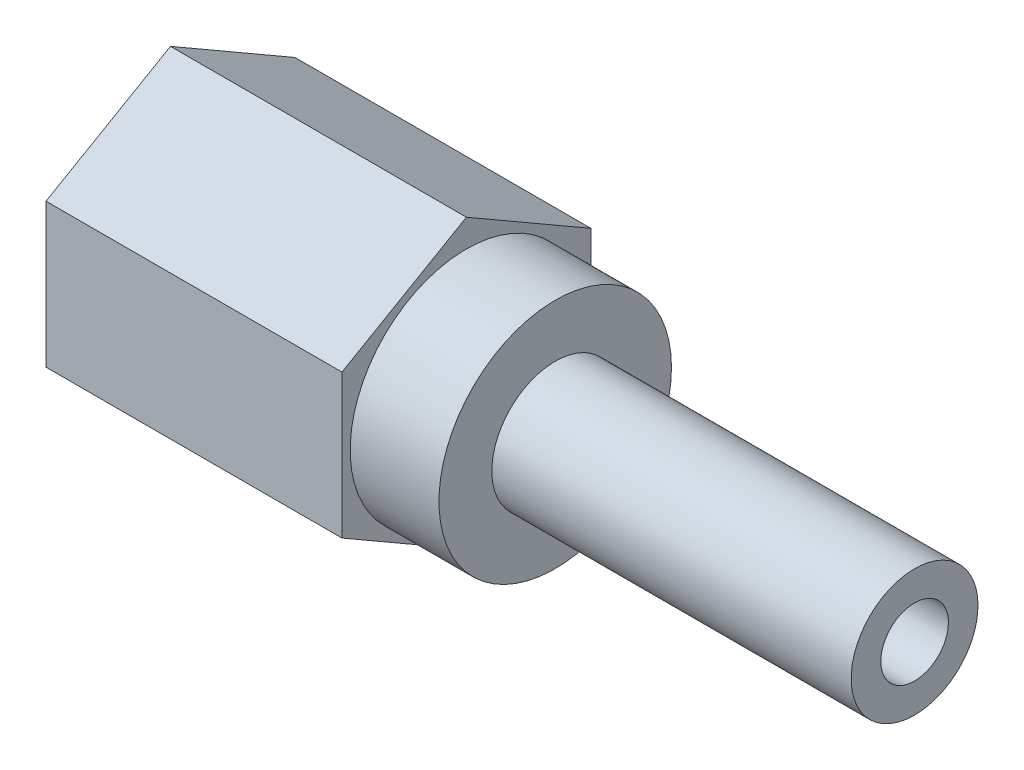
ISO-10303-21;
HEADER;
FILE_DESCRIPTION(('STEP AP214'),'2;1');
FILE_NAME('part.step','',(''),(''),'','','');
FILE_SCHEMA(('AUTOMOTIVE_DESIGN { 1 0 10303 214 1 1 1 1 }'));
ENDSEC;
DATA;
#1=APPLICATION_CONTEXT('core data for automotive mechanical design processes');
#2=APPLICATION_PROTOCOL_DEFINITION('international standard','automotive_design',2000,#1);
#3=PRODUCT_CONTEXT('',#1,'mechanical');
#4=PRODUCT('Part','Part','',(#3));
#5=PRODUCT_RELATED_PRODUCT_CATEGORY('part','',(#4));
#6=PRODUCT_DEFINITION_FORMATION('','',#4);
#7=PRODUCT_DEFINITION_CONTEXT('part definition',#1,'design');
#8=PRODUCT_DEFINITION('design','',#6,#7);
#9=PRODUCT_DEFINITION_SHAPE('','',#8);
#10=(LENGTH_UNIT() NAMED_UNIT(*) SI_UNIT(.MILLI.,.METRE.));
#11=(NAMED_UNIT(*) PLANE_ANGLE_UNIT() SI_UNIT($,.RADIAN.));
#12=(NAMED_UNIT(*) SI_UNIT($,.STERADIAN.) SOLID_ANGLE_UNIT());
#13=UNCERTAINTY_MEASURE_WITH_UNIT(LENGTH_MEASURE(1.E-05),#10,'distance_accuracy_value','');
#14=(GEOMETRIC_REPRESENTATION_CONTEXT(3) GLOBAL_UNCERTAINTY_ASSIGNED_CONTEXT((#13)) GLOBAL_UNIT_ASSIGNED_CONTEXT((#10,
#11,#12)) REPRESENTATION_CONTEXT('',''));
#15=CARTESIAN_POINT('',(0.,0.,0.));
#16=DIRECTION('',(0.,0.,1.));
#17=DIRECTION('',(1.,0.,0.));
#18=AXIS2_PLACEMENT_3D('',#15,#16,#17);
#19=CARTESIAN_POINT('',(7.,1.7,-2.94448637286709));
#20=DIRECTION('',(0.,-0.866025403784439,0.5));
#21=DIRECTION('',(0.,-0.5,-0.866025403784439));
#22=AXIS2_PLACEMENT_3D('',#19,#20,#21);
#23=PLANE('',#22);
#24=DIRECTION('',(0.,0.5,0.866025403784439));
#25=VECTOR('',#24,1.);
#26=CARTESIAN_POINT('',(0.,1.7,-2.94448637286709));
#27=LINE('',#26,#25);
#28=CARTESIAN_POINT('',(0.,1.7,-2.94448637286709));
#29=VERTEX_POINT('',#28);
#30=CARTESIAN_POINT('',(0.,3.4,0.));
#31=VERTEX_POINT('',#30);
#32=EDGE_CURVE('E136',#29,#31,#27,.T.);
#33=ORIENTED_EDGE('',*,*,#32,.T.);
#34=DIRECTION('',(-1.,0.,0.));
#35=VECTOR('',#34,1.);
#36=CARTESIAN_POINT('',(7.,3.4,0.));
#37=LINE('',#36,#35);
#38=CARTESIAN_POINT('',(7.,3.4,0.));
#39=VERTEX_POINT('',#38);
#40=EDGE_CURVE('E47',#39,#31,#37,.T.);
#41=ORIENTED_EDGE('',*,*,#40,.F.);
#42=DIRECTION('',(0.,0.5,0.866025403784439));
#43=VECTOR('',#42,1.);
#44=CARTESIAN_POINT('',(7.,1.7,-2.94448637286709));
#45=LINE('',#44,#43);
#46=CARTESIAN_POINT('',(7.,1.7,-2.94448637286709));
#47=VERTEX_POINT('',#46);
#48=EDGE_CURVE('E153',#47,#39,#45,.T.);
#49=ORIENTED_EDGE('',*,*,#48,.F.);
#50=DIRECTION('',(-1.,0.,0.));
#51=VECTOR('',#50,1.);
#52=CARTESIAN_POINT('',(7.,1.7,-2.94448637286709));
#53=LINE('',#52,#51);
#54=EDGE_CURVE('E132',#47,#29,#53,.T.);
#55=ORIENTED_EDGE('',*,*,#54,.T.);
#56=EDGE_LOOP('',(#33,#41,#49,#55));
#57=FACE_BOUND('',#56,.T.);
#58=ADVANCED_FACE('F44',(#57),#23,.F.);
#59=CARTESIAN_POINT('',(7.,3.4,0.));
#60=DIRECTION('',(0.,-0.866025403784439,-0.5));
#61=DIRECTION('',(0.,0.5,-0.866025403784439));
#62=AXIS2_PLACEMENT_3D('',#59,#60,#61);
#63=PLANE('',#62);
#64=DIRECTION('',(0.,-0.5,0.866025403784439));
#65=VECTOR('',#64,1.);
#66=CARTESIAN_POINT('',(0.,3.4,0.));
#67=LINE('',#66,#65);
#68=CARTESIAN_POINT('',(0.,1.7,2.94448637286709));
#69=VERTEX_POINT('',#68);
#70=EDGE_CURVE('E140',#31,#69,#67,.T.);
#71=ORIENTED_EDGE('',*,*,#70,.T.);
#72=DIRECTION('',(-1.,0.,0.));
#73=VECTOR('',#72,1.);
#74=CARTESIAN_POINT('',(7.,1.7,2.94448637286709));
#75=LINE('',#74,#73);
#76=CARTESIAN_POINT('',(7.,1.7,2.94448637286709));
#77=VERTEX_POINT('',#76);
#78=EDGE_CURVE('E159',#77,#69,#75,.T.);
#79=ORIENTED_EDGE('',*,*,#78,.F.);
#80=DIRECTION('',(0.,-0.5,0.866025403784439));
#81=VECTOR('',#80,1.);
#82=CARTESIAN_POINT('',(7.,3.4,0.));
#83=LINE('',#82,#81);
#84=EDGE_CURVE('E101',#39,#77,#83,.T.);
#85=ORIENTED_EDGE('',*,*,#84,.F.);
#86=ORIENTED_EDGE('',*,*,#40,.T.);
#87=EDGE_LOOP('',(#71,#79,#85,#86));
#88=FACE_BOUND('',#87,.T.);
#89=ADVANCED_FACE('F235',(#88),#63,.F.);
#90=CARTESIAN_POINT('',(7.,1.7,2.94448637286709));
#91=DIRECTION('',(0.,0.,-1.));
#92=DIRECTION('',(-1.,0.,0.));
#93=AXIS2_PLACEMENT_3D('',#90,#91,#92);
#94=PLANE('',#93);
#95=DIRECTION('',(0.,-1.,0.));
#96=VECTOR('',#95,1.);
#97=CARTESIAN_POINT('',(0.,1.7,2.94448637286709));
#98=LINE('',#97,#96);
#99=CARTESIAN_POINT('',(0.,-1.7,2.94448637286709));
#100=VERTEX_POINT('',#99);
#101=EDGE_CURVE('E144',#69,#100,#98,.T.);
#102=ORIENTED_EDGE('',*,*,#101,.T.);
#103=DIRECTION('',(-1.,0.,0.));
#104=VECTOR('',#103,1.);
#105=CARTESIAN_POINT('',(7.,-1.7,2.94448637286709));
#106=LINE('',#105,#104);
#107=CARTESIAN_POINT('',(7.,-1.7,2.94448637286709));
#108=VERTEX_POINT('',#107);
#109=EDGE_CURVE('E125',#108,#100,#106,.T.);
#110=ORIENTED_EDGE('',*,*,#109,.F.);
#111=DIRECTION('',(0.,-1.,0.));
#112=VECTOR('',#111,1.);
#113=CARTESIAN_POINT('',(7.,1.7,2.94448637286709));
#114=LINE('',#113,#112);
#115=EDGE_CURVE('E114',#77,#108,#114,.T.);
#116=ORIENTED_EDGE('',*,*,#115,.F.);
#117=ORIENTED_EDGE('',*,*,#78,.T.);
#118=EDGE_LOOP('',(#102,#110,#116,#117));
#119=FACE_BOUND('',#118,.T.);
#120=ADVANCED_FACE('F239',(#119),#94,.F.);
#121=CARTESIAN_POINT('',(7.,-1.7,2.94448637286709));
#122=DIRECTION('',(0.,0.866025403784439,-0.5));
#123=DIRECTION('',(0.,0.5,0.866025403784439));
#124=AXIS2_PLACEMENT_3D('',#121,#122,#123);
#125=PLANE('',#124);
#126=DIRECTION('',(0.,-0.5,-0.866025403784439));
#127=VECTOR('',#126,1.);
#128=CARTESIAN_POINT('',(0.,-1.7,2.94448637286709));
#129=LINE('',#128,#127);
#130=CARTESIAN_POINT('',(0.,-3.4,0.));
#131=VERTEX_POINT('',#130);
#132=EDGE_CURVE('E123',#100,#131,#129,.T.);
#133=ORIENTED_EDGE('',*,*,#132,.T.);
#134=DIRECTION('',(-1.,0.,0.));
#135=VECTOR('',#134,1.);
#136=CARTESIAN_POINT('',(7.,-3.4,0.));
#137=LINE('',#136,#135);
#138=CARTESIAN_POINT('',(7.,-3.4,0.));
#139=VERTEX_POINT('',#138);
#140=EDGE_CURVE('E120',#139,#131,#137,.T.);
#141=ORIENTED_EDGE('',*,*,#140,.F.);
#142=DIRECTION('',(0.,-0.5,-0.866025403784439));
#143=VECTOR('',#142,1.);
#144=CARTESIAN_POINT('',(7.,-1.7,2.94448637286709));
#145=LINE('',#144,#143);
#146=EDGE_CURVE('E108',#108,#139,#145,.T.);
#147=ORIENTED_EDGE('',*,*,#146,.F.);
#148=ORIENTED_EDGE('',*,*,#109,.T.);
#149=EDGE_LOOP('',(#133,#141,#147,#148));
#150=FACE_BOUND('',#149,.T.);
#151=ADVANCED_FACE('F121',(#150),#125,.F.);
#152=CARTESIAN_POINT('',(7.,-3.4,0.));
#153=DIRECTION('',(0.,0.866025403784438,0.5));
#154=DIRECTION('',(0.,-0.5,0.866025403784439));
#155=AXIS2_PLACEMENT_3D('',#152,#153,#154);
#156=PLANE('',#155);
#157=DIRECTION('',(0.,0.5,-0.866025403784438));
#158=VECTOR('',#157,1.);
#159=CARTESIAN_POINT('',(0.,-3.4,0.));
#160=LINE('',#159,#158);
#161=CARTESIAN_POINT('',(0.,-1.7,-2.94448637286709));
#162=VERTEX_POINT('',#161);
#163=EDGE_CURVE('E86',#131,#162,#160,.T.);
#164=ORIENTED_EDGE('',*,*,#163,.T.);
#165=DIRECTION('',(-1.,0.,0.));
#166=VECTOR('',#165,1.);
#167=CARTESIAN_POINT('',(7.,-1.7,-2.94448637286709));
#168=LINE('',#167,#166);
#169=CARTESIAN_POINT('',(7.,-1.7,-2.94448637286709));
#170=VERTEX_POINT('',#169);
#171=EDGE_CURVE('E126',#170,#162,#168,.T.);
#172=ORIENTED_EDGE('',*,*,#171,.F.);
#173=DIRECTION('',(0.,0.5,-0.866025403784438));
#174=VECTOR('',#173,1.);
#175=CARTESIAN_POINT('',(7.,-3.4,0.));
#176=LINE('',#175,#174);
#177=EDGE_CURVE('E112',#139,#170,#176,.T.);
#178=ORIENTED_EDGE('',*,*,#177,.F.);
#179=ORIENTED_EDGE('',*,*,#140,.T.);
#180=EDGE_LOOP('',(#164,#172,#178,#179));
#181=FACE_BOUND('',#180,.T.);
#182=ADVANCED_FACE('F128',(#181),#156,.F.);
#183=CARTESIAN_POINT('',(7.,-1.7,-2.94448637286709));
#184=DIRECTION('',(0.,0.,1.));
#185=DIRECTION('',(0.,-1.,0.));
#186=AXIS2_PLACEMENT_3D('',#183,#184,#185);
#187=PLANE('',#186);
#188=DIRECTION('',(0.,1.,0.));
#189=VECTOR('',#188,1.);
#190=CARTESIAN_POINT('',(0.,-1.7,-2.94448637286709));
#191=LINE('',#190,#189);
#192=EDGE_CURVE('E92',#162,#29,#191,.T.);
#193=ORIENTED_EDGE('',*,*,#192,.T.);
#194=ORIENTED_EDGE('',*,*,#54,.F.);
#195=DIRECTION('',(0.,1.,0.));
#196=VECTOR('',#195,1.);
#197=CARTESIAN_POINT('',(7.,-1.7,-2.94448637286709));
#198=LINE('',#197,#196);
#199=EDGE_CURVE('E63',#170,#47,#198,.T.);
#200=ORIENTED_EDGE('',*,*,#199,.F.);
#201=ORIENTED_EDGE('',*,*,#171,.T.);
#202=EDGE_LOOP('',(#193,#194,#200,#201));
#203=FACE_BOUND('',#202,.T.);
#204=ADVANCED_FACE('F224',(#203),#187,.F.);
#205=CARTESIAN_POINT('',(7.,0.,0.));
#206=DIRECTION('',(1.,0.,0.));
#207=DIRECTION('',(0.,0.,-1.));
#208=AXIS2_PLACEMENT_3D('',#205,#206,#207);
#209=PLANE('',#208);
#210=CARTESIAN_POINT('',(7.,0.,0.));
#211=DIRECTION('',(1.,0.,0.));
#212=DIRECTION('',(0.,0.,-1.));
#213=AXIS2_PLACEMENT_3D('',#210,#211,#212);
#214=CIRCLE('',#213,2.75);
#215=CARTESIAN_POINT('',(7.,0.,-2.75));
#216=VERTEX_POINT('',#215);
#217=EDGE_CURVE('E54',#216,#216,#214,.T.);
#218=ORIENTED_EDGE('',*,*,#217,.F.);
#219=EDGE_LOOP('',(#218));
#220=FACE_BOUND('',#219,.T.);
#221=ORIENTED_EDGE('',*,*,#48,.T.);
#222=ORIENTED_EDGE('',*,*,#84,.T.);
#223=ORIENTED_EDGE('',*,*,#115,.T.);
#224=ORIENTED_EDGE('',*,*,#146,.T.);
#225=ORIENTED_EDGE('',*,*,#177,.T.);
#226=ORIENTED_EDGE('',*,*,#199,.T.);
#227=EDGE_LOOP('',(#221,#222,#223,#224,#225,#226));
#228=FACE_BOUND('',#227,.T.);
#229=ADVANCED_FACE('F110',(#220,#228),#209,.T.);
#230=CARTESIAN_POINT('',(0.,0.,0.));
#231=DIRECTION('',(1.,0.,0.));
#232=DIRECTION('',(0.,0.,-1.));
#233=AXIS2_PLACEMENT_3D('',#230,#231,#232);
#234=PLANE('',#233);
#235=CARTESIAN_POINT('',(0.,0.,0.));
#236=DIRECTION('',(-1.,0.,0.));
#237=DIRECTION('',(0.,0.,1.));
#238=AXIS2_PLACEMENT_3D('',#235,#236,#237);
#239=CIRCLE('',#238,1.5);
#240=CARTESIAN_POINT('',(0.,0.,1.5));
#241=VERTEX_POINT('',#240);
#242=EDGE_CURVE('E187',#241,#241,#239,.T.);
#243=ORIENTED_EDGE('',*,*,#242,.F.);
#244=EDGE_LOOP('',(#243));
#245=FACE_BOUND('',#244,.T.);
#246=ORIENTED_EDGE('',*,*,#32,.F.);
#247=ORIENTED_EDGE('',*,*,#192,.F.);
#248=ORIENTED_EDGE('',*,*,#163,.F.);
#249=ORIENTED_EDGE('',*,*,#132,.F.);
#250=ORIENTED_EDGE('',*,*,#101,.F.);
#251=ORIENTED_EDGE('',*,*,#70,.F.);
#252=EDGE_LOOP('',(#246,#247,#248,#249,#250,#251));
#253=FACE_BOUND('',#252,.T.);
#254=ADVANCED_FACE('F216',(#245,#253),#234,.F.);
#255=CARTESIAN_POINT('',(9.1,0.,0.));
#256=DIRECTION('',(-1.,0.,0.));
#257=DIRECTION('',(0.,0.,1.));
#258=AXIS2_PLACEMENT_3D('',#255,#256,#257);
#259=CYLINDRICAL_SURFACE('',#258,2.75);
#260=CARTESIAN_POINT('',(9.1,0.,0.));
#261=DIRECTION('',(1.,0.,0.));
#262=DIRECTION('',(0.,0.,-1.));
#263=AXIS2_PLACEMENT_3D('',#260,#261,#262);
#264=CIRCLE('',#263,2.75);
#265=CARTESIAN_POINT('',(9.1,0.,-2.75));
#266=VERTEX_POINT('',#265);
#267=EDGE_CURVE('E141',#266,#266,#264,.T.);
#268=ORIENTED_EDGE('',*,*,#267,.F.);
#269=EDGE_LOOP('',(#268));
#270=FACE_BOUND('',#269,.T.);
#271=ORIENTED_EDGE('',*,*,#217,.T.);
#272=EDGE_LOOP('',(#271));
#273=FACE_BOUND('',#272,.T.);
#274=ADVANCED_FACE('F219',(#270,#273),#259,.T.);
#275=CARTESIAN_POINT('',(9.1,0.,0.));
#276=DIRECTION('',(1.,0.,0.));
#277=DIRECTION('',(0.,0.,-1.));
#278=AXIS2_PLACEMENT_3D('',#275,#276,#277);
#279=PLANE('',#278);
#280=CARTESIAN_POINT('',(9.1,0.,0.));
#281=DIRECTION('',(1.,0.,0.));
#282=DIRECTION('',(0.,0.,-1.));
#283=AXIS2_PLACEMENT_3D('',#280,#281,#282);
#284=CIRCLE('',#283,1.5);
#285=CARTESIAN_POINT('',(9.1,0.,-1.5));
#286=VERTEX_POINT('',#285);
#287=EDGE_CURVE('E11',#286,#286,#284,.T.);
#288=ORIENTED_EDGE('',*,*,#287,.F.);
#289=EDGE_LOOP('',(#288));
#290=FACE_BOUND('',#289,.T.);
#291=ORIENTED_EDGE('',*,*,#267,.T.);
#292=EDGE_LOOP('',(#291));
#293=FACE_BOUND('',#292,.T.);
#294=ADVANCED_FACE('F282',(#290,#293),#279,.T.);
#295=CARTESIAN_POINT('',(17.6,0.,0.));
#296=DIRECTION('',(-1.,0.,0.));
#297=DIRECTION('',(0.,0.,1.));
#298=AXIS2_PLACEMENT_3D('',#295,#296,#297);
#299=CYLINDRICAL_SURFACE('',#298,1.5);
#300=CARTESIAN_POINT('',(17.6,0.,0.));
#301=DIRECTION('',(1.,0.,0.));
#302=DIRECTION('',(0.,0.,-1.));
#303=AXIS2_PLACEMENT_3D('',#300,#301,#302);
#304=CIRCLE('',#303,1.5);
#305=CARTESIAN_POINT('',(17.6,0.,-1.5));
#306=VERTEX_POINT('',#305);
#307=EDGE_CURVE('E180',#306,#306,#304,.T.);
#308=ORIENTED_EDGE('',*,*,#307,.F.);
#309=EDGE_LOOP('',(#308));
#310=FACE_BOUND('',#309,.T.);
#311=ORIENTED_EDGE('',*,*,#287,.T.);
#312=EDGE_LOOP('',(#311));
#313=FACE_BOUND('',#312,.T.);
#314=ADVANCED_FACE('F292',(#310,#313),#299,.T.);
#315=CARTESIAN_POINT('',(17.6,0.,0.));
#316=DIRECTION('',(1.,0.,0.));
#317=DIRECTION('',(0.,0.,-1.));
#318=AXIS2_PLACEMENT_3D('',#315,#316,#317);
#319=PLANE('',#318);
#320=CARTESIAN_POINT('',(17.6,0.,0.));
#321=DIRECTION('',(-1.,0.,0.));
#322=DIRECTION('',(0.,0.,1.));
#323=AXIS2_PLACEMENT_3D('',#320,#321,#322);
#324=CIRCLE('',#323,0.8);
#325=CARTESIAN_POINT('',(17.6,0.,0.8));
#326=VERTEX_POINT('',#325);
#327=EDGE_CURVE('E191',#326,#326,#324,.T.);
#328=ORIENTED_EDGE('',*,*,#327,.T.);
#329=EDGE_LOOP('',(#328));
#330=FACE_BOUND('',#329,.T.);
#331=ORIENTED_EDGE('',*,*,#307,.T.);
#332=EDGE_LOOP('',(#331));
#333=FACE_BOUND('',#332,.T.);
#334=ADVANCED_FACE('F212',(#330,#333),#319,.T.);
#335=CARTESIAN_POINT('',(5.,0.,0.));
#336=DIRECTION('',(-1.,0.,0.));
#337=DIRECTION('',(0.,0.,1.));
#338=AXIS2_PLACEMENT_3D('',#335,#336,#337);
#339=CYLINDRICAL_SURFACE('',#338,1.5);
#340=CARTESIAN_POINT('',(5.,0.,0.));
#341=DIRECTION('',(-1.,0.,0.));
#342=DIRECTION('',(0.,0.,1.));
#343=AXIS2_PLACEMENT_3D('',#340,#341,#342);
#344=CIRCLE('',#343,1.5);
#345=CARTESIAN_POINT('',(5.,0.,1.5));
#346=VERTEX_POINT('',#345);
#347=EDGE_CURVE('E183',#346,#346,#344,.T.);
#348=ORIENTED_EDGE('',*,*,#347,.F.);
#349=EDGE_LOOP('',(#348));
#350=FACE_BOUND('',#349,.T.);
#351=ORIENTED_EDGE('',*,*,#242,.T.);
#352=EDGE_LOOP('',(#351));
#353=FACE_BOUND('',#352,.T.);
#354=ADVANCED_FACE('F206',(#350,#353),#339,.F.);
#355=CARTESIAN_POINT('',(5.,0.,0.));
#356=DIRECTION('',(-1.,0.,0.));
#357=DIRECTION('',(0.,0.,1.));
#358=AXIS2_PLACEMENT_3D('',#355,#356,#357);
#359=PLANE('',#358);
#360=CARTESIAN_POINT('',(5.,0.,0.));
#361=DIRECTION('',(-1.,0.,0.));
#362=DIRECTION('',(0.,0.,1.));
#363=AXIS2_PLACEMENT_3D('',#360,#361,#362);
#364=CIRCLE('',#363,0.8);
#365=CARTESIAN_POINT('',(5.,0.,0.8));
#366=VERTEX_POINT('',#365);
#367=EDGE_CURVE('E195',#366,#366,#364,.T.);
#368=ORIENTED_EDGE('',*,*,#367,.F.);
#369=EDGE_LOOP('',(#368));
#370=FACE_BOUND('',#369,.T.);
#371=ORIENTED_EDGE('',*,*,#347,.T.);
#372=EDGE_LOOP('',(#371));
#373=FACE_BOUND('',#372,.T.);
#374=ADVANCED_FACE('F203',(#370,#373),#359,.T.);
#375=CARTESIAN_POINT('',(17.6,0.,0.));
#376=DIRECTION('',(-1.,0.,0.));
#377=DIRECTION('',(0.,0.,1.));
#378=AXIS2_PLACEMENT_3D('',#375,#376,#377);
#379=CYLINDRICAL_SURFACE('',#378,0.8);
#380=ORIENTED_EDGE('',*,*,#327,.F.);
#381=EDGE_LOOP('',(#380));
#382=FACE_BOUND('',#381,.T.);
#383=ORIENTED_EDGE('',*,*,#367,.T.);
#384=EDGE_LOOP('',(#383));
#385=FACE_BOUND('',#384,.T.);
#386=ADVANCED_FACE('F201',(#382,#385),#379,.F.);
#387=CLOSED_SHELL('',(#58,#89,#120,#151,#182,#204,#229,#254,#274,#294,#314,#334,#354,#374,#386));
#388=MANIFOLD_SOLID_BREP('B2',#387);
#389=ADVANCED_BREP_SHAPE_REPRESENTATION('',(#18,#388),#14);
#390=SHAPE_DEFINITION_REPRESENTATION(#9,#389);
ENDSEC;
END-ISO-10303-21;
